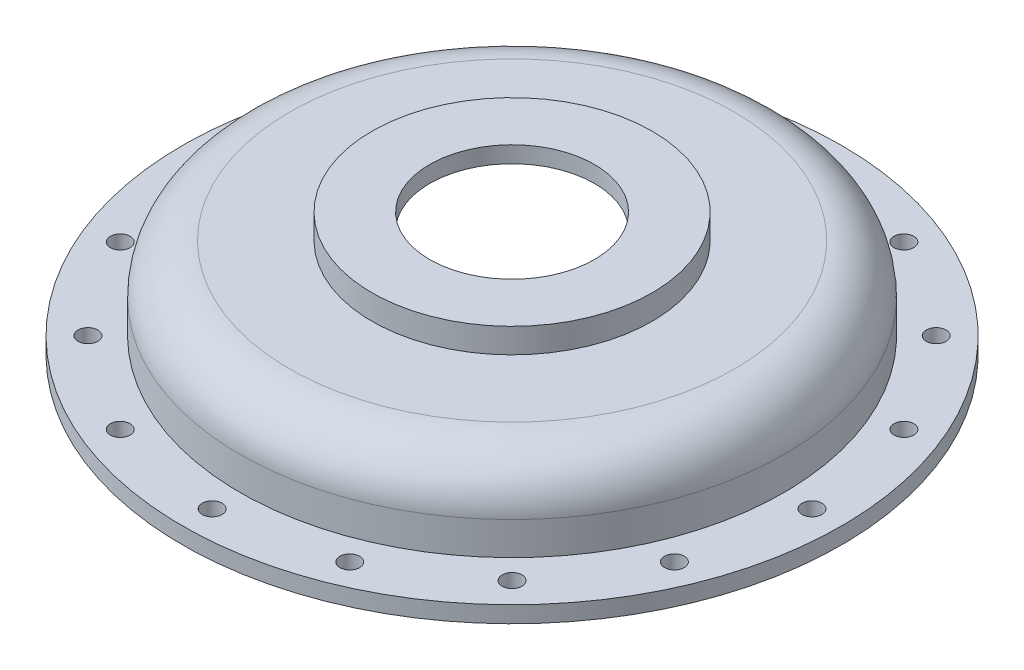
ISO-10303-21;
HEADER;
FILE_DESCRIPTION(('STEP AP214'),'2;1');
FILE_NAME('part.step','',(''),(''),'','','');
FILE_SCHEMA(('AUTOMOTIVE_DESIGN { 1 0 10303 214 1 1 1 1 }'));
ENDSEC;
DATA;
#1=APPLICATION_CONTEXT('core data for automotive mechanical design processes');
#2=APPLICATION_PROTOCOL_DEFINITION('international standard','automotive_design',2000,#1);
#3=PRODUCT_CONTEXT('',#1,'mechanical');
#4=PRODUCT('Part','Part','',(#3));
#5=PRODUCT_RELATED_PRODUCT_CATEGORY('part','',(#4));
#6=PRODUCT_DEFINITION_FORMATION('','',#4);
#7=PRODUCT_DEFINITION_CONTEXT('part definition',#1,'design');
#8=PRODUCT_DEFINITION('design','',#6,#7);
#9=PRODUCT_DEFINITION_SHAPE('','',#8);
#10=(LENGTH_UNIT() NAMED_UNIT(*) SI_UNIT(.MILLI.,.METRE.));
#11=(NAMED_UNIT(*) PLANE_ANGLE_UNIT() SI_UNIT($,.RADIAN.));
#12=(NAMED_UNIT(*) SI_UNIT($,.STERADIAN.) SOLID_ANGLE_UNIT());
#13=UNCERTAINTY_MEASURE_WITH_UNIT(LENGTH_MEASURE(1.E-05),#10,'distance_accuracy_value','');
#14=(GEOMETRIC_REPRESENTATION_CONTEXT(3) GLOBAL_UNCERTAINTY_ASSIGNED_CONTEXT((#13)) GLOBAL_UNIT_ASSIGNED_CONTEXT((#10,
#11,#12)) REPRESENTATION_CONTEXT('',''));
#15=CARTESIAN_POINT('',(0.,0.,0.));
#16=DIRECTION('',(0.,0.,1.));
#17=DIRECTION('',(1.,0.,0.));
#18=AXIS2_PLACEMENT_3D('',#15,#16,#17);
#19=CARTESIAN_POINT('',(200.,-46.5685424949238,0.));
#20=DIRECTION('',(0.,1.,0.));
#21=DIRECTION('',(0.,0.,1.));
#22=AXIS2_PLACEMENT_3D('',#19,#20,#21);
#23=PLANE('',#22);
#24=CARTESIAN_POINT('',(-128.693434175952,-46.5685424949238,-128.693434175951));
#25=DIRECTION('',(0.,1.,0.));
#26=DIRECTION('',(0.707106781186549,0.,0.707106781186546));
#27=AXIS2_PLACEMENT_3D('',#24,#25,#26);
#28=CIRCLE('',#27,6.);
#29=CARTESIAN_POINT('',(-124.450793488833,-46.5685424949238,-124.450793488832));
#30=VERTEX_POINT('',#29);
#31=EDGE_CURVE('E172',#30,#30,#28,.T.);
#32=ORIENTED_EDGE('',*,*,#31,.F.);
#33=EDGE_LOOP('',(#32));
#34=FACE_BOUND('',#33,.T.);
#35=CARTESIAN_POINT('',(-168.146074917054,-46.5685424949238,-69.6483846904459));
#36=DIRECTION('',(0.,1.,0.));
#37=DIRECTION('',(0.923879532511288,0.,0.382683432365087));
#38=AXIS2_PLACEMENT_3D('',#35,#36,#37);
#39=CIRCLE('',#38,6.);
#40=CARTESIAN_POINT('',(-162.602797721987,-46.5685424949238,-67.3522840962554));
#41=VERTEX_POINT('',#40);
#42=EDGE_CURVE('E164',#41,#41,#39,.T.);
#43=ORIENTED_EDGE('',*,*,#42,.F.);
#44=EDGE_LOOP('',(#43));
#45=FACE_BOUND('',#44,.T.);
#46=CARTESIAN_POINT('',(-182.,-46.5685424949238,6.3544960366945E-13));
#47=DIRECTION('',(0.,1.,0.));
#48=DIRECTION('',(1.,0.,0.));
#49=AXIS2_PLACEMENT_3D('',#46,#47,#48);
#50=CIRCLE('',#49,6.);
#51=CARTESIAN_POINT('',(-176.,-46.5685424949238,6.14500715636391E-13));
#52=VERTEX_POINT('',#51);
#53=EDGE_CURVE('E156',#52,#52,#50,.T.);
#54=ORIENTED_EDGE('',*,*,#53,.F.);
#55=EDGE_LOOP('',(#54));
#56=FACE_BOUND('',#55,.T.);
#57=CARTESIAN_POINT('',(-168.146074917054,-46.5685424949238,69.6483846904471));
#58=DIRECTION('',(0.,1.,0.));
#59=DIRECTION('',(0.923879532511285,0.,-0.382683432365094));
#60=AXIS2_PLACEMENT_3D('',#57,#58,#59);
#61=CIRCLE('',#60,6.);
#62=CARTESIAN_POINT('',(-162.602797721986,-46.5685424949238,67.3522840962565));
#63=VERTEX_POINT('',#62);
#64=EDGE_CURVE('E148',#63,#63,#61,.T.);
#65=ORIENTED_EDGE('',*,*,#64,.F.);
#66=EDGE_LOOP('',(#65));
#67=FACE_BOUND('',#66,.T.);
#68=CARTESIAN_POINT('',(-128.693434175951,-46.5685424949238,128.693434175952));
#69=DIRECTION('',(0.,1.,0.));
#70=DIRECTION('',(0.707106781186544,0.,-0.707106781186551));
#71=AXIS2_PLACEMENT_3D('',#68,#69,#70);
#72=CIRCLE('',#71,6.);
#73=CARTESIAN_POINT('',(-124.450793488832,-46.5685424949238,124.450793488833));
#74=VERTEX_POINT('',#73);
#75=EDGE_CURVE('E140',#74,#74,#72,.T.);
#76=ORIENTED_EDGE('',*,*,#75,.F.);
#77=EDGE_LOOP('',(#76));
#78=FACE_BOUND('',#77,.T.);
#79=CARTESIAN_POINT('',(-69.6483846904453,-46.5685424949238,168.146074917055));
#80=DIRECTION('',(0.,1.,0.));
#81=DIRECTION('',(0.382683432365084,0.,-0.923879532511289));
#82=AXIS2_PLACEMENT_3D('',#79,#80,#81);
#83=CIRCLE('',#82,6.);
#84=CARTESIAN_POINT('',(-67.3522840962548,-46.5685424949238,162.602797721987));
#85=VERTEX_POINT('',#84);
#86=EDGE_CURVE('E132',#85,#85,#83,.T.);
#87=ORIENTED_EDGE('',*,*,#86,.F.);
#88=EDGE_LOOP('',(#87));
#89=FACE_BOUND('',#88,.T.);
#90=CARTESIAN_POINT('',(0.,-46.5685424949238,182.));
#91=DIRECTION('',(0.,1.,0.));
#92=DIRECTION('',(0.,0.,-1.));
#93=AXIS2_PLACEMENT_3D('',#90,#91,#92);
#94=CIRCLE('',#93,6.);
#95=CARTESIAN_POINT('',(0.,-46.5685424949238,176.));
#96=VERTEX_POINT('',#95);
#97=EDGE_CURVE('E124',#96,#96,#94,.T.);
#98=ORIENTED_EDGE('',*,*,#97,.F.);
#99=EDGE_LOOP('',(#98));
#100=FACE_BOUND('',#99,.T.);
#101=CARTESIAN_POINT('',(69.6483846904477,-46.5685424949238,168.146074917054));
#102=DIRECTION('',(0.,1.,0.));
#103=DIRECTION('',(-0.382683432365097,0.,-0.923879532511284));
#104=AXIS2_PLACEMENT_3D('',#101,#102,#103);
#105=CIRCLE('',#104,6.);
#106=CARTESIAN_POINT('',(67.3522840962571,-46.5685424949238,162.602797721986));
#107=VERTEX_POINT('',#106);
#108=EDGE_CURVE('E115',#107,#107,#105,.T.);
#109=ORIENTED_EDGE('',*,*,#108,.F.);
#110=EDGE_LOOP('',(#109));
#111=FACE_BOUND('',#110,.T.);
#112=CARTESIAN_POINT('',(128.693434175953,-46.5685424949238,128.693434175951));
#113=DIRECTION('',(0.,1.,0.));
#114=DIRECTION('',(-0.707106781186554,0.,-0.707106781186541));
#115=AXIS2_PLACEMENT_3D('',#112,#113,#114);
#116=CIRCLE('',#115,6.);
#117=CARTESIAN_POINT('',(124.450793488833,-46.5685424949238,124.450793488831));
#118=VERTEX_POINT('',#117);
#119=EDGE_CURVE('E219',#118,#118,#116,.T.);
#120=ORIENTED_EDGE('',*,*,#119,.F.);
#121=EDGE_LOOP('',(#120));
#122=FACE_BOUND('',#121,.T.);
#123=CARTESIAN_POINT('',(168.146074917055,-46.5685424949238,69.6483846904447));
#124=DIRECTION('',(0.,1.,0.));
#125=DIRECTION('',(-0.923879532511291,0.,-0.382683432365081));
#126=AXIS2_PLACEMENT_3D('',#123,#124,#125);
#127=CIRCLE('',#126,6.);
#128=CARTESIAN_POINT('',(162.602797721987,-46.5685424949238,67.3522840962542));
#129=VERTEX_POINT('',#128);
#130=EDGE_CURVE('E211',#129,#129,#127,.T.);
#131=ORIENTED_EDGE('',*,*,#130,.F.);
#132=EDGE_LOOP('',(#131));
#133=FACE_BOUND('',#132,.T.);
#134=CARTESIAN_POINT('',(182.,-46.5685424949238,-1.90634881100835E-12));
#135=DIRECTION('',(0.,1.,0.));
#136=DIRECTION('',(-1.,0.,0.));
#137=AXIS2_PLACEMENT_3D('',#134,#135,#136);
#138=CIRCLE('',#137,6.);
#139=CARTESIAN_POINT('',(176.,-46.5685424949238,-1.84350214690917E-12));
#140=VERTEX_POINT('',#139);
#141=EDGE_CURVE('E203',#140,#140,#138,.T.);
#142=ORIENTED_EDGE('',*,*,#141,.F.);
#143=EDGE_LOOP('',(#142));
#144=FACE_BOUND('',#143,.T.);
#145=CARTESIAN_POINT('',(168.146074917053,-46.5685424949238,-69.6483846904482));
#146=DIRECTION('',(0.,1.,0.));
#147=DIRECTION('',(-0.923879532511283,0.,0.3826834323651));
#148=AXIS2_PLACEMENT_3D('',#145,#146,#147);
#149=CIRCLE('',#148,6.);
#150=CARTESIAN_POINT('',(162.602797721986,-46.5685424949238,-67.3522840962576));
#151=VERTEX_POINT('',#150);
#152=EDGE_CURVE('E195',#151,#151,#149,.T.);
#153=ORIENTED_EDGE('',*,*,#152,.F.);
#154=EDGE_LOOP('',(#153));
#155=FACE_BOUND('',#154,.T.);
#156=CARTESIAN_POINT('',(128.69343417595,-46.5685424949238,-128.693434175953));
#157=DIRECTION('',(0.,1.,0.));
#158=DIRECTION('',(-0.707106781186539,0.,0.707106781186556));
#159=AXIS2_PLACEMENT_3D('',#156,#157,#158);
#160=CIRCLE('',#159,6.);
#161=CARTESIAN_POINT('',(124.450793488831,-46.5685424949238,-124.450793488834));
#162=VERTEX_POINT('',#161);
#163=EDGE_CURVE('E187',#162,#162,#160,.T.);
#164=ORIENTED_EDGE('',*,*,#163,.F.);
#165=EDGE_LOOP('',(#164));
#166=FACE_BOUND('',#165,.T.);
#167=CARTESIAN_POINT('',(69.6483846904441,-46.5685424949238,-168.146074917055));
#168=DIRECTION('',(0.,1.,0.));
#169=DIRECTION('',(-0.382683432365077,0.,0.923879532511292));
#170=AXIS2_PLACEMENT_3D('',#167,#168,#169);
#171=CIRCLE('',#170,6.);
#172=CARTESIAN_POINT('',(67.3522840962536,-46.5685424949238,-162.602797721987));
#173=VERTEX_POINT('',#172);
#174=EDGE_CURVE('E179',#173,#173,#171,.T.);
#175=ORIENTED_EDGE('',*,*,#174,.F.);
#176=EDGE_LOOP('',(#175));
#177=FACE_BOUND('',#176,.T.);
#178=CARTESIAN_POINT('',(-69.6483846904465,-46.5685424949238,-168.146074917054));
#179=DIRECTION('',(0.,1.,0.));
#180=DIRECTION('',(0.382683432365091,0.,0.923879532511287));
#181=AXIS2_PLACEMENT_3D('',#178,#179,#180);
#182=CIRCLE('',#181,6.);
#183=CARTESIAN_POINT('',(-67.352284096256,-46.5685424949238,-162.602797721986));
#184=VERTEX_POINT('',#183);
#185=EDGE_CURVE('E107',#184,#184,#182,.T.);
#186=ORIENTED_EDGE('',*,*,#185,.F.);
#187=EDGE_LOOP('',(#186));
#188=FACE_BOUND('',#187,.T.);
#189=CARTESIAN_POINT('',(0.,-46.5685424949238,-182.));
#190=DIRECTION('',(0.,1.,0.));
#191=DIRECTION('',(0.,0.,1.));
#192=AXIS2_PLACEMENT_3D('',#189,#190,#191);
#193=CIRCLE('',#192,6.);
#194=CARTESIAN_POINT('',(0.,-46.5685424949238,-176.));
#195=VERTEX_POINT('',#194);
#196=EDGE_CURVE('E99',#195,#195,#193,.T.);
#197=ORIENTED_EDGE('',*,*,#196,.F.);
#198=EDGE_LOOP('',(#197));
#199=FACE_BOUND('',#198,.T.);
#200=CARTESIAN_POINT('',(0.,-46.5685424949238,0.));
#201=DIRECTION('',(0.,-1.,0.));
#202=DIRECTION('',(0.,0.,-1.));
#203=AXIS2_PLACEMENT_3D('',#200,#201,#202);
#204=CIRCLE('',#203,165.);
#205=CARTESIAN_POINT('',(0.,-46.5685424949238,-165.));
#206=VERTEX_POINT('',#205);
#207=EDGE_CURVE('E10',#206,#206,#204,.T.);
#208=ORIENTED_EDGE('',*,*,#207,.T.);
#209=EDGE_LOOP('',(#208));
#210=FACE_BOUND('',#209,.T.);
#211=CARTESIAN_POINT('',(0.,-46.5685424949238,0.));
#212=DIRECTION('',(0.,-1.,0.));
#213=DIRECTION('',(0.,0.,-1.));
#214=AXIS2_PLACEMENT_3D('',#211,#212,#213);
#215=CIRCLE('',#214,200.);
#216=CARTESIAN_POINT('',(0.,-46.5685424949238,-200.));
#217=VERTEX_POINT('',#216);
#218=EDGE_CURVE('E94',#217,#217,#215,.T.);
#219=ORIENTED_EDGE('',*,*,#218,.F.);
#220=EDGE_LOOP('',(#219));
#221=FACE_BOUND('',#220,.T.);
#222=ADVANCED_FACE('F43',(#34,#45,#56,#67,#78,#89,#100,#111,#122,#133,#144,#155,#166,#177,#188,
#199,#210,#221),#23,.T.);
#223=CARTESIAN_POINT('',(0.,0.,0.));
#224=DIRECTION('',(0.,-1.,0.));
#225=DIRECTION('',(0.,0.,-1.));
#226=AXIS2_PLACEMENT_3D('',#223,#224,#225);
#227=CYLINDRICAL_SURFACE('',#226,165.);
#228=CARTESIAN_POINT('',(0.,-26.5685424949238,0.));
#229=DIRECTION('',(0.,-1.,0.));
#230=DIRECTION('',(0.,0.,-1.));
#231=AXIS2_PLACEMENT_3D('',#228,#229,#230);
#232=CIRCLE('',#231,165.);
#233=CARTESIAN_POINT('',(0.,-26.5685424949238,-165.));
#234=VERTEX_POINT('',#233);
#235=EDGE_CURVE('E51',#234,#234,#232,.T.);
#236=ORIENTED_EDGE('',*,*,#235,.T.);
#237=EDGE_LOOP('',(#236));
#238=FACE_BOUND('',#237,.T.);
#239=ORIENTED_EDGE('',*,*,#207,.F.);
#240=EDGE_LOOP('',(#239));
#241=FACE_BOUND('',#240,.T.);
#242=ADVANCED_FACE('F257',(#238,#241),#227,.T.);
#243=CARTESIAN_POINT('',(0.,-26.5685424949238,0.));
#244=DIRECTION('',(0.,-1.,0.));
#245=DIRECTION('',(0.,0.,-1.));
#246=AXIS2_PLACEMENT_3D('',#243,#244,#245);
#247=TOROIDAL_SURFACE('',#246,135.,30.);
#248=CARTESIAN_POINT('',(0.,3.43145750507618,0.));
#249=DIRECTION('',(0.,-1.,0.));
#250=DIRECTION('',(0.,0.,-1.));
#251=AXIS2_PLACEMENT_3D('',#248,#249,#250);
#252=CIRCLE('',#251,135.);
#253=CARTESIAN_POINT('',(0.,3.43145750507618,-135.));
#254=VERTEX_POINT('',#253);
#255=EDGE_CURVE('E56',#254,#254,#252,.T.);
#256=ORIENTED_EDGE('',*,*,#255,.T.);
#257=EDGE_LOOP('',(#256));
#258=FACE_BOUND('',#257,.T.);
#259=ORIENTED_EDGE('',*,*,#235,.F.);
#260=EDGE_LOOP('',(#259));
#261=FACE_BOUND('',#260,.T.);
#262=ADVANCED_FACE('F264',(#258,#261),#247,.T.);
#263=CARTESIAN_POINT('',(135.,3.43145750507617,0.));
#264=DIRECTION('',(0.,1.,0.));
#265=DIRECTION('',(0.,0.,1.));
#266=AXIS2_PLACEMENT_3D('',#263,#264,#265);
#267=PLANE('',#266);
#268=CARTESIAN_POINT('',(0.,3.43145750507617,0.));
#269=DIRECTION('',(0.,-1.,0.));
#270=DIRECTION('',(0.,0.,-1.));
#271=AXIS2_PLACEMENT_3D('',#268,#269,#270);
#272=CIRCLE('',#271,85.);
#273=CARTESIAN_POINT('',(0.,3.43145750507617,-85.));
#274=VERTEX_POINT('',#273);
#275=EDGE_CURVE('E62',#274,#274,#272,.T.);
#276=ORIENTED_EDGE('',*,*,#275,.T.);
#277=EDGE_LOOP('',(#276));
#278=FACE_BOUND('',#277,.T.);
#279=ORIENTED_EDGE('',*,*,#255,.F.);
#280=EDGE_LOOP('',(#279));
#281=FACE_BOUND('',#280,.T.);
#282=ADVANCED_FACE('F545',(#278,#281),#267,.T.);
#283=CARTESIAN_POINT('',(0.,0.,0.));
#284=DIRECTION('',(0.,-1.,0.));
#285=DIRECTION('',(0.,0.,-1.));
#286=AXIS2_PLACEMENT_3D('',#283,#284,#285);
#287=CYLINDRICAL_SURFACE('',#286,85.);
#288=CARTESIAN_POINT('',(0.,18.4314575050762,0.));
#289=DIRECTION('',(0.,-1.,0.));
#290=DIRECTION('',(0.,0.,-1.));
#291=AXIS2_PLACEMENT_3D('',#288,#289,#290);
#292=CIRCLE('',#291,85.);
#293=CARTESIAN_POINT('',(0.,18.4314575050762,-85.));
#294=VERTEX_POINT('',#293);
#295=EDGE_CURVE('E66',#294,#294,#292,.T.);
#296=ORIENTED_EDGE('',*,*,#295,.T.);
#297=EDGE_LOOP('',(#296));
#298=FACE_BOUND('',#297,.T.);
#299=ORIENTED_EDGE('',*,*,#275,.F.);
#300=EDGE_LOOP('',(#299));
#301=FACE_BOUND('',#300,.T.);
#302=ADVANCED_FACE('F405',(#298,#301),#287,.T.);
#303=CARTESIAN_POINT('',(85.,18.4314575050762,0.));
#304=DIRECTION('',(0.,1.,0.));
#305=DIRECTION('',(0.,0.,1.));
#306=AXIS2_PLACEMENT_3D('',#303,#304,#305);
#307=PLANE('',#306);
#308=CARTESIAN_POINT('',(0.,18.4314575050762,0.));
#309=DIRECTION('',(0.,1.,0.));
#310=DIRECTION('',(0.,0.,1.));
#311=AXIS2_PLACEMENT_3D('',#308,#309,#310);
#312=CIRCLE('',#311,50.);
#313=CARTESIAN_POINT('',(0.,18.4314575050762,50.));
#314=VERTEX_POINT('',#313);
#315=EDGE_CURVE('E226',#314,#314,#312,.T.);
#316=ORIENTED_EDGE('',*,*,#315,.F.);
#317=EDGE_LOOP('',(#316));
#318=FACE_BOUND('',#317,.T.);
#319=ORIENTED_EDGE('',*,*,#295,.F.);
#320=EDGE_LOOP('',(#319));
#321=FACE_BOUND('',#320,.T.);
#322=ADVANCED_FACE('F241',(#318,#321),#307,.T.);
#323=CARTESIAN_POINT('',(0.,8.43145750507615,0.));
#324=DIRECTION('',(0.,-1.,0.));
#325=DIRECTION('',(0.,0.,-1.));
#326=AXIS2_PLACEMENT_3D('',#323,#324,#325);
#327=PLANE('',#326);
#328=CARTESIAN_POINT('',(0.,8.43145750507615,0.));
#329=DIRECTION('',(0.,-1.,0.));
#330=DIRECTION('',(0.,0.,-1.));
#331=AXIS2_PLACEMENT_3D('',#328,#329,#330);
#332=CIRCLE('',#331,50.);
#333=CARTESIAN_POINT('',(0.,8.43145750507615,-50.));
#334=VERTEX_POINT('',#333);
#335=EDGE_CURVE('E46',#334,#334,#332,.T.);
#336=ORIENTED_EDGE('',*,*,#335,.F.);
#337=EDGE_LOOP('',(#336));
#338=FACE_BOUND('',#337,.T.);
#339=CARTESIAN_POINT('',(0.,8.43145750507614,0.));
#340=DIRECTION('',(0.,-1.,0.));
#341=DIRECTION('',(0.,0.,-1.));
#342=AXIS2_PLACEMENT_3D('',#339,#340,#341);
#343=CIRCLE('',#342,75.);
#344=CARTESIAN_POINT('',(0.,8.43145750507614,-75.));
#345=VERTEX_POINT('',#344);
#346=EDGE_CURVE('E70',#345,#345,#343,.T.);
#347=ORIENTED_EDGE('',*,*,#346,.T.);
#348=EDGE_LOOP('',(#347));
#349=FACE_BOUND('',#348,.T.);
#350=ADVANCED_FACE('F237',(#338,#349),#327,.T.);
#351=CARTESIAN_POINT('',(0.,0.,0.));
#352=DIRECTION('',(0.,-1.,0.));
#353=DIRECTION('',(0.,0.,-1.));
#354=AXIS2_PLACEMENT_3D('',#351,#352,#353);
#355=CYLINDRICAL_SURFACE('',#354,75.);
#356=CARTESIAN_POINT('',(0.,-6.56854249492383,0.));
#357=DIRECTION('',(0.,-1.,0.));
#358=DIRECTION('',(0.,0.,-1.));
#359=AXIS2_PLACEMENT_3D('',#356,#357,#358);
#360=CIRCLE('',#359,75.);
#361=CARTESIAN_POINT('',(0.,-6.56854249492383,-75.));
#362=VERTEX_POINT('',#361);
#363=EDGE_CURVE('E74',#362,#362,#360,.T.);
#364=ORIENTED_EDGE('',*,*,#363,.T.);
#365=EDGE_LOOP('',(#364));
#366=FACE_BOUND('',#365,.T.);
#367=ORIENTED_EDGE('',*,*,#346,.F.);
#368=EDGE_LOOP('',(#367));
#369=FACE_BOUND('',#368,.T.);
#370=ADVANCED_FACE('F240',(#366,#369),#355,.F.);
#371=CARTESIAN_POINT('',(75.,-6.56854249492383,0.));
#372=DIRECTION('',(0.,-1.,0.));
#373=DIRECTION('',(0.,0.,-1.));
#374=AXIS2_PLACEMENT_3D('',#371,#372,#373);
#375=PLANE('',#374);
#376=CARTESIAN_POINT('',(0.,-6.56854249492383,0.));
#377=DIRECTION('',(0.,-1.,0.));
#378=DIRECTION('',(0.,0.,-1.));
#379=AXIS2_PLACEMENT_3D('',#376,#377,#378);
#380=CIRCLE('',#379,134.255065140802);
#381=CARTESIAN_POINT('',(0.,-6.56854249492383,-134.255065140802));
#382=VERTEX_POINT('',#381);
#383=EDGE_CURVE('E78',#382,#382,#380,.T.);
#384=ORIENTED_EDGE('',*,*,#383,.T.);
#385=EDGE_LOOP('',(#384));
#386=FACE_BOUND('',#385,.T.);
#387=ORIENTED_EDGE('',*,*,#363,.F.);
#388=EDGE_LOOP('',(#387));
#389=FACE_BOUND('',#388,.T.);
#390=ADVANCED_FACE('F246',(#386,#389),#375,.T.);
#391=CARTESIAN_POINT('',(0.,-27.3273505527333,0.));
#392=DIRECTION('',(0.,-1.,0.));
#393=DIRECTION('',(0.,0.,-1.));
#394=AXIS2_PLACEMENT_3D('',#391,#392,#393);
#395=TOROIDAL_SURFACE('',#394,134.255065140802,20.7588080578095);
#396=CARTESIAN_POINT('',(0.,-26.5685424949238,0.));
#397=DIRECTION('',(0.,-1.,0.));
#398=DIRECTION('',(0.,0.,-1.));
#399=AXIS2_PLACEMENT_3D('',#396,#397,#398);
#400=CIRCLE('',#399,155.);
#401=CARTESIAN_POINT('',(0.,-26.5685424949238,-155.));
#402=VERTEX_POINT('',#401);
#403=EDGE_CURVE('E82',#402,#402,#400,.T.);
#404=ORIENTED_EDGE('',*,*,#403,.T.);
#405=EDGE_LOOP('',(#404));
#406=FACE_BOUND('',#405,.T.);
#407=ORIENTED_EDGE('',*,*,#383,.F.);
#408=EDGE_LOOP('',(#407));
#409=FACE_BOUND('',#408,.T.);
#410=ADVANCED_FACE('F253',(#406,#409),#395,.F.);
#411=CARTESIAN_POINT('',(0.,0.,0.));
#412=DIRECTION('',(0.,-1.,0.));
#413=DIRECTION('',(0.,0.,-1.));
#414=AXIS2_PLACEMENT_3D('',#411,#412,#413);
#415=CYLINDRICAL_SURFACE('',#414,155.);
#416=CARTESIAN_POINT('',(0.,-56.5685424949238,0.));
#417=DIRECTION('',(0.,-1.,0.));
#418=DIRECTION('',(0.,0.,-1.));
#419=AXIS2_PLACEMENT_3D('',#416,#417,#418);
#420=CIRCLE('',#419,155.);
#421=CARTESIAN_POINT('',(0.,-56.5685424949238,-155.));
#422=VERTEX_POINT('',#421);
#423=EDGE_CURVE('E86',#422,#422,#420,.T.);
#424=ORIENTED_EDGE('',*,*,#423,.T.);
#425=EDGE_LOOP('',(#424));
#426=FACE_BOUND('',#425,.T.);
#427=ORIENTED_EDGE('',*,*,#403,.F.);
#428=EDGE_LOOP('',(#427));
#429=FACE_BOUND('',#428,.T.);
#430=ADVANCED_FACE('F309',(#426,#429),#415,.F.);
#431=CARTESIAN_POINT('',(155.,-56.5685424949238,0.));
#432=DIRECTION('',(0.,-1.,0.));
#433=DIRECTION('',(0.,0.,-1.));
#434=AXIS2_PLACEMENT_3D('',#431,#432,#433);
#435=PLANE('',#434);
#436=CARTESIAN_POINT('',(-128.693434175952,-56.5685424949238,-128.693434175951));
#437=DIRECTION('',(0.,1.,0.));
#438=DIRECTION('',(0.707106781186549,0.,0.707106781186546));
#439=AXIS2_PLACEMENT_3D('',#436,#437,#438);
#440=CIRCLE('',#439,6.);
#441=CARTESIAN_POINT('',(-124.450793488833,-56.5685424949238,-124.450793488832));
#442=VERTEX_POINT('',#441);
#443=EDGE_CURVE('E111',#442,#442,#440,.T.);
#444=ORIENTED_EDGE('',*,*,#443,.T.);
#445=EDGE_LOOP('',(#444));
#446=FACE_BOUND('',#445,.T.);
#447=CARTESIAN_POINT('',(-168.146074917054,-56.5685424949238,-69.6483846904459));
#448=DIRECTION('',(0.,1.,0.));
#449=DIRECTION('',(0.923879532511288,0.,0.382683432365087));
#450=AXIS2_PLACEMENT_3D('',#447,#448,#449);
#451=CIRCLE('',#450,6.);
#452=CARTESIAN_POINT('',(-162.602797721987,-56.5685424949238,-67.3522840962554));
#453=VERTEX_POINT('',#452);
#454=EDGE_CURVE('E168',#453,#453,#451,.T.);
#455=ORIENTED_EDGE('',*,*,#454,.T.);
#456=EDGE_LOOP('',(#455));
#457=FACE_BOUND('',#456,.T.);
#458=CARTESIAN_POINT('',(-182.,-56.5685424949238,6.3544960366945E-13));
#459=DIRECTION('',(0.,1.,0.));
#460=DIRECTION('',(1.,0.,0.));
#461=AXIS2_PLACEMENT_3D('',#458,#459,#460);
#462=CIRCLE('',#461,6.);
#463=CARTESIAN_POINT('',(-176.,-56.5685424949238,6.14500715636391E-13));
#464=VERTEX_POINT('',#463);
#465=EDGE_CURVE('E160',#464,#464,#462,.T.);
#466=ORIENTED_EDGE('',*,*,#465,.T.);
#467=EDGE_LOOP('',(#466));
#468=FACE_BOUND('',#467,.T.);
#469=CARTESIAN_POINT('',(-168.146074917054,-56.5685424949238,69.6483846904471));
#470=DIRECTION('',(0.,1.,0.));
#471=DIRECTION('',(0.923879532511285,0.,-0.382683432365094));
#472=AXIS2_PLACEMENT_3D('',#469,#470,#471);
#473=CIRCLE('',#472,6.);
#474=CARTESIAN_POINT('',(-162.602797721986,-56.5685424949238,67.3522840962565));
#475=VERTEX_POINT('',#474);
#476=EDGE_CURVE('E152',#475,#475,#473,.T.);
#477=ORIENTED_EDGE('',*,*,#476,.T.);
#478=EDGE_LOOP('',(#477));
#479=FACE_BOUND('',#478,.T.);
#480=CARTESIAN_POINT('',(-128.693434175951,-56.5685424949238,128.693434175952));
#481=DIRECTION('',(0.,1.,0.));
#482=DIRECTION('',(0.707106781186544,0.,-0.707106781186551));
#483=AXIS2_PLACEMENT_3D('',#480,#481,#482);
#484=CIRCLE('',#483,6.);
#485=CARTESIAN_POINT('',(-124.450793488832,-56.5685424949238,124.450793488833));
#486=VERTEX_POINT('',#485);
#487=EDGE_CURVE('E144',#486,#486,#484,.T.);
#488=ORIENTED_EDGE('',*,*,#487,.T.);
#489=EDGE_LOOP('',(#488));
#490=FACE_BOUND('',#489,.T.);
#491=CARTESIAN_POINT('',(-69.6483846904453,-56.5685424949238,168.146074917055));
#492=DIRECTION('',(0.,1.,0.));
#493=DIRECTION('',(0.382683432365084,0.,-0.923879532511289));
#494=AXIS2_PLACEMENT_3D('',#491,#492,#493);
#495=CIRCLE('',#494,6.);
#496=CARTESIAN_POINT('',(-67.3522840962548,-56.5685424949238,162.602797721987));
#497=VERTEX_POINT('',#496);
#498=EDGE_CURVE('E136',#497,#497,#495,.T.);
#499=ORIENTED_EDGE('',*,*,#498,.T.);
#500=EDGE_LOOP('',(#499));
#501=FACE_BOUND('',#500,.T.);
#502=CARTESIAN_POINT('',(0.,-56.5685424949238,182.));
#503=DIRECTION('',(0.,1.,0.));
#504=DIRECTION('',(0.,0.,-1.));
#505=AXIS2_PLACEMENT_3D('',#502,#503,#504);
#506=CIRCLE('',#505,6.);
#507=CARTESIAN_POINT('',(0.,-56.5685424949238,176.));
#508=VERTEX_POINT('',#507);
#509=EDGE_CURVE('E128',#508,#508,#506,.T.);
#510=ORIENTED_EDGE('',*,*,#509,.T.);
#511=EDGE_LOOP('',(#510));
#512=FACE_BOUND('',#511,.T.);
#513=CARTESIAN_POINT('',(69.6483846904477,-56.5685424949238,168.146074917054));
#514=DIRECTION('',(0.,1.,0.));
#515=DIRECTION('',(-0.382683432365097,0.,-0.923879532511284));
#516=AXIS2_PLACEMENT_3D('',#513,#514,#515);
#517=CIRCLE('',#516,6.);
#518=CARTESIAN_POINT('',(67.3522840962571,-56.5685424949238,162.602797721986));
#519=VERTEX_POINT('',#518);
#520=EDGE_CURVE('E119',#519,#519,#517,.T.);
#521=ORIENTED_EDGE('',*,*,#520,.T.);
#522=EDGE_LOOP('',(#521));
#523=FACE_BOUND('',#522,.T.);
#524=CARTESIAN_POINT('',(128.693434175953,-56.5685424949238,128.693434175951));
#525=DIRECTION('',(0.,1.,0.));
#526=DIRECTION('',(-0.707106781186554,0.,-0.707106781186541));
#527=AXIS2_PLACEMENT_3D('',#524,#525,#526);
#528=CIRCLE('',#527,6.);
#529=CARTESIAN_POINT('',(124.450793488833,-56.5685424949238,124.450793488831));
#530=VERTEX_POINT('',#529);
#531=EDGE_CURVE('E120',#530,#530,#528,.T.);
#532=ORIENTED_EDGE('',*,*,#531,.T.);
#533=EDGE_LOOP('',(#532));
#534=FACE_BOUND('',#533,.T.);
#535=CARTESIAN_POINT('',(168.146074917055,-56.5685424949238,69.6483846904447));
#536=DIRECTION('',(0.,1.,0.));
#537=DIRECTION('',(-0.923879532511291,0.,-0.382683432365081));
#538=AXIS2_PLACEMENT_3D('',#535,#536,#537);
#539=CIRCLE('',#538,6.);
#540=CARTESIAN_POINT('',(162.602797721987,-56.5685424949238,67.3522840962542));
#541=VERTEX_POINT('',#540);
#542=EDGE_CURVE('E215',#541,#541,#539,.T.);
#543=ORIENTED_EDGE('',*,*,#542,.T.);
#544=EDGE_LOOP('',(#543));
#545=FACE_BOUND('',#544,.T.);
#546=CARTESIAN_POINT('',(182.,-56.5685424949238,-1.90634881100835E-12));
#547=DIRECTION('',(0.,1.,0.));
#548=DIRECTION('',(-1.,0.,0.));
#549=AXIS2_PLACEMENT_3D('',#546,#547,#548);
#550=CIRCLE('',#549,6.);
#551=CARTESIAN_POINT('',(176.,-56.5685424949238,-1.84350214690917E-12));
#552=VERTEX_POINT('',#551);
#553=EDGE_CURVE('E207',#552,#552,#550,.T.);
#554=ORIENTED_EDGE('',*,*,#553,.T.);
#555=EDGE_LOOP('',(#554));
#556=FACE_BOUND('',#555,.T.);
#557=CARTESIAN_POINT('',(168.146074917053,-56.5685424949238,-69.6483846904482));
#558=DIRECTION('',(0.,1.,0.));
#559=DIRECTION('',(-0.923879532511283,0.,0.3826834323651));
#560=AXIS2_PLACEMENT_3D('',#557,#558,#559);
#561=CIRCLE('',#560,6.);
#562=CARTESIAN_POINT('',(162.602797721986,-56.5685424949238,-67.3522840962576));
#563=VERTEX_POINT('',#562);
#564=EDGE_CURVE('E199',#563,#563,#561,.T.);
#565=ORIENTED_EDGE('',*,*,#564,.T.);
#566=EDGE_LOOP('',(#565));
#567=FACE_BOUND('',#566,.T.);
#568=CARTESIAN_POINT('',(128.69343417595,-56.5685424949238,-128.693434175953));
#569=DIRECTION('',(0.,1.,0.));
#570=DIRECTION('',(-0.707106781186539,0.,0.707106781186556));
#571=AXIS2_PLACEMENT_3D('',#568,#569,#570);
#572=CIRCLE('',#571,6.);
#573=CARTESIAN_POINT('',(124.450793488831,-56.5685424949238,-124.450793488834));
#574=VERTEX_POINT('',#573);
#575=EDGE_CURVE('E191',#574,#574,#572,.T.);
#576=ORIENTED_EDGE('',*,*,#575,.T.);
#577=EDGE_LOOP('',(#576));
#578=FACE_BOUND('',#577,.T.);
#579=CARTESIAN_POINT('',(69.6483846904441,-56.5685424949238,-168.146074917055));
#580=DIRECTION('',(0.,1.,0.));
#581=DIRECTION('',(-0.382683432365077,0.,0.923879532511292));
#582=AXIS2_PLACEMENT_3D('',#579,#580,#581);
#583=CIRCLE('',#582,6.);
#584=CARTESIAN_POINT('',(67.3522840962536,-56.5685424949238,-162.602797721987));
#585=VERTEX_POINT('',#584);
#586=EDGE_CURVE('E183',#585,#585,#583,.T.);
#587=ORIENTED_EDGE('',*,*,#586,.T.);
#588=EDGE_LOOP('',(#587));
#589=FACE_BOUND('',#588,.T.);
#590=CARTESIAN_POINT('',(-69.6483846904465,-56.5685424949238,-168.146074917054));
#591=DIRECTION('',(0.,1.,0.));
#592=DIRECTION('',(0.382683432365091,0.,0.923879532511287));
#593=AXIS2_PLACEMENT_3D('',#590,#591,#592);
#594=CIRCLE('',#593,6.);
#595=CARTESIAN_POINT('',(-67.352284096256,-56.5685424949238,-162.602797721986));
#596=VERTEX_POINT('',#595);
#597=EDGE_CURVE('E103',#596,#596,#594,.T.);
#598=ORIENTED_EDGE('',*,*,#597,.T.);
#599=EDGE_LOOP('',(#598));
#600=FACE_BOUND('',#599,.T.);
#601=CARTESIAN_POINT('',(0.,-56.5685424949238,-182.));
#602=DIRECTION('',(0.,1.,0.));
#603=DIRECTION('',(0.,0.,1.));
#604=AXIS2_PLACEMENT_3D('',#601,#602,#603);
#605=CIRCLE('',#604,6.);
#606=CARTESIAN_POINT('',(0.,-56.5685424949238,-176.));
#607=VERTEX_POINT('',#606);
#608=EDGE_CURVE('E98',#607,#607,#605,.T.);
#609=ORIENTED_EDGE('',*,*,#608,.T.);
#610=EDGE_LOOP('',(#609));
#611=FACE_BOUND('',#610,.T.);
#612=CARTESIAN_POINT('',(0.,-56.5685424949238,0.));
#613=DIRECTION('',(0.,-1.,0.));
#614=DIRECTION('',(0.,0.,-1.));
#615=AXIS2_PLACEMENT_3D('',#612,#613,#614);
#616=CIRCLE('',#615,200.);
#617=CARTESIAN_POINT('',(0.,-56.5685424949238,-200.));
#618=VERTEX_POINT('',#617);
#619=EDGE_CURVE('E90',#618,#618,#616,.T.);
#620=ORIENTED_EDGE('',*,*,#619,.T.);
#621=EDGE_LOOP('',(#620));
#622=FACE_BOUND('',#621,.T.);
#623=ORIENTED_EDGE('',*,*,#423,.F.);
#624=EDGE_LOOP('',(#623));
#625=FACE_BOUND('',#624,.T.);
#626=ADVANCED_FACE('F304',(#446,#457,#468,#479,#490,#501,#512,#523,#534,#545,#556,#567,#578,
#589,#600,#611,#622,#625),#435,.T.);
#627=CARTESIAN_POINT('',(0.,0.,0.));
#628=DIRECTION('',(0.,-1.,0.));
#629=DIRECTION('',(0.,0.,-1.));
#630=AXIS2_PLACEMENT_3D('',#627,#628,#629);
#631=CYLINDRICAL_SURFACE('',#630,200.);
#632=ORIENTED_EDGE('',*,*,#218,.T.);
#633=EDGE_LOOP('',(#632));
#634=FACE_BOUND('',#633,.T.);
#635=ORIENTED_EDGE('',*,*,#619,.F.);
#636=EDGE_LOOP('',(#635));
#637=FACE_BOUND('',#636,.T.);
#638=ADVANCED_FACE('F300',(#634,#637),#631,.T.);
#639=CARTESIAN_POINT('',(0.,-56.5685424949238,-182.));
#640=DIRECTION('',(0.,1.,0.));
#641=DIRECTION('',(0.,0.,1.));
#642=AXIS2_PLACEMENT_3D('',#639,#640,#641);
#643=CYLINDRICAL_SURFACE('',#642,6.);
#644=ORIENTED_EDGE('',*,*,#608,.F.);
#645=EDGE_LOOP('',(#644));
#646=FACE_BOUND('',#645,.T.);
#647=ORIENTED_EDGE('',*,*,#196,.T.);
#648=EDGE_LOOP('',(#647));
#649=FACE_BOUND('',#648,.T.);
#650=ADVANCED_FACE('F303',(#646,#649),#643,.F.);
#651=CARTESIAN_POINT('',(-69.6483846904465,-56.5685424949238,-168.146074917054));
#652=DIRECTION('',(0.,1.,0.));
#653=DIRECTION('',(0.,0.,1.));
#654=AXIS2_PLACEMENT_3D('',#651,#652,#653);
#655=CYLINDRICAL_SURFACE('',#654,6.);
#656=ORIENTED_EDGE('',*,*,#597,.F.);
#657=EDGE_LOOP('',(#656));
#658=FACE_BOUND('',#657,.T.);
#659=ORIENTED_EDGE('',*,*,#185,.T.);
#660=EDGE_LOOP('',(#659));
#661=FACE_BOUND('',#660,.T.);
#662=ADVANCED_FACE('F329',(#658,#661),#655,.F.);
#663=CARTESIAN_POINT('',(69.6483846904441,-56.5685424949238,-168.146074917055));
#664=DIRECTION('',(0.,1.,0.));
#665=DIRECTION('',(0.,0.,1.));
#666=AXIS2_PLACEMENT_3D('',#663,#664,#665);
#667=CYLINDRICAL_SURFACE('',#666,6.);
#668=ORIENTED_EDGE('',*,*,#586,.F.);
#669=EDGE_LOOP('',(#668));
#670=FACE_BOUND('',#669,.T.);
#671=ORIENTED_EDGE('',*,*,#174,.T.);
#672=EDGE_LOOP('',(#671));
#673=FACE_BOUND('',#672,.T.);
#674=ADVANCED_FACE('F333',(#670,#673),#667,.F.);
#675=CARTESIAN_POINT('',(128.69343417595,-56.5685424949238,-128.693434175953));
#676=DIRECTION('',(0.,1.,0.));
#677=DIRECTION('',(0.,0.,1.));
#678=AXIS2_PLACEMENT_3D('',#675,#676,#677);
#679=CYLINDRICAL_SURFACE('',#678,6.);
#680=ORIENTED_EDGE('',*,*,#575,.F.);
#681=EDGE_LOOP('',(#680));
#682=FACE_BOUND('',#681,.T.);
#683=ORIENTED_EDGE('',*,*,#163,.T.);
#684=EDGE_LOOP('',(#683));
#685=FACE_BOUND('',#684,.T.);
#686=ADVANCED_FACE('F370',(#682,#685),#679,.F.);
#687=CARTESIAN_POINT('',(168.146074917053,-56.5685424949238,-69.6483846904482));
#688=DIRECTION('',(0.,1.,0.));
#689=DIRECTION('',(0.,0.,1.));
#690=AXIS2_PLACEMENT_3D('',#687,#688,#689);
#691=CYLINDRICAL_SURFACE('',#690,6.);
#692=ORIENTED_EDGE('',*,*,#564,.F.);
#693=EDGE_LOOP('',(#692));
#694=FACE_BOUND('',#693,.T.);
#695=ORIENTED_EDGE('',*,*,#152,.T.);
#696=EDGE_LOOP('',(#695));
#697=FACE_BOUND('',#696,.T.);
#698=ADVANCED_FACE('F374',(#694,#697),#691,.F.);
#699=CARTESIAN_POINT('',(182.,-56.5685424949238,-1.90634881100835E-12));
#700=DIRECTION('',(0.,1.,0.));
#701=DIRECTION('',(0.,0.,1.));
#702=AXIS2_PLACEMENT_3D('',#699,#700,#701);
#703=CYLINDRICAL_SURFACE('',#702,6.);
#704=ORIENTED_EDGE('',*,*,#553,.F.);
#705=EDGE_LOOP('',(#704));
#706=FACE_BOUND('',#705,.T.);
#707=ORIENTED_EDGE('',*,*,#141,.T.);
#708=EDGE_LOOP('',(#707));
#709=FACE_BOUND('',#708,.T.);
#710=ADVANCED_FACE('F378',(#706,#709),#703,.F.);
#711=CARTESIAN_POINT('',(168.146074917055,-56.5685424949238,69.6483846904447));
#712=DIRECTION('',(0.,1.,0.));
#713=DIRECTION('',(0.,0.,1.));
#714=AXIS2_PLACEMENT_3D('',#711,#712,#713);
#715=CYLINDRICAL_SURFACE('',#714,6.);
#716=ORIENTED_EDGE('',*,*,#542,.F.);
#717=EDGE_LOOP('',(#716));
#718=FACE_BOUND('',#717,.T.);
#719=ORIENTED_EDGE('',*,*,#130,.T.);
#720=EDGE_LOOP('',(#719));
#721=FACE_BOUND('',#720,.T.);
#722=ADVANCED_FACE('F382',(#718,#721),#715,.F.);
#723=CARTESIAN_POINT('',(128.693434175953,-56.5685424949238,128.693434175951));
#724=DIRECTION('',(0.,1.,0.));
#725=DIRECTION('',(0.,0.,1.));
#726=AXIS2_PLACEMENT_3D('',#723,#724,#725);
#727=CYLINDRICAL_SURFACE('',#726,6.);
#728=ORIENTED_EDGE('',*,*,#531,.F.);
#729=EDGE_LOOP('',(#728));
#730=FACE_BOUND('',#729,.T.);
#731=ORIENTED_EDGE('',*,*,#119,.T.);
#732=EDGE_LOOP('',(#731));
#733=FACE_BOUND('',#732,.T.);
#734=ADVANCED_FACE('F339',(#730,#733),#727,.F.);
#735=CARTESIAN_POINT('',(69.6483846904477,-56.5685424949238,168.146074917054));
#736=DIRECTION('',(0.,1.,0.));
#737=DIRECTION('',(0.,0.,1.));
#738=AXIS2_PLACEMENT_3D('',#735,#736,#737);
#739=CYLINDRICAL_SURFACE('',#738,6.);
#740=ORIENTED_EDGE('',*,*,#520,.F.);
#741=EDGE_LOOP('',(#740));
#742=FACE_BOUND('',#741,.T.);
#743=ORIENTED_EDGE('',*,*,#108,.T.);
#744=EDGE_LOOP('',(#743));
#745=FACE_BOUND('',#744,.T.);
#746=ADVANCED_FACE('F335',(#742,#745),#739,.F.);
#747=CARTESIAN_POINT('',(0.,-56.5685424949238,182.));
#748=DIRECTION('',(0.,1.,0.));
#749=DIRECTION('',(0.,0.,1.));
#750=AXIS2_PLACEMENT_3D('',#747,#748,#749);
#751=CYLINDRICAL_SURFACE('',#750,6.);
#752=ORIENTED_EDGE('',*,*,#509,.F.);
#753=EDGE_LOOP('',(#752));
#754=FACE_BOUND('',#753,.T.);
#755=ORIENTED_EDGE('',*,*,#97,.T.);
#756=EDGE_LOOP('',(#755));
#757=FACE_BOUND('',#756,.T.);
#758=ADVANCED_FACE('F338',(#754,#757),#751,.F.);
#759=CARTESIAN_POINT('',(-69.6483846904453,-56.5685424949238,168.146074917055));
#760=DIRECTION('',(0.,1.,0.));
#761=DIRECTION('',(0.,0.,1.));
#762=AXIS2_PLACEMENT_3D('',#759,#760,#761);
#763=CYLINDRICAL_SURFACE('',#762,6.);
#764=ORIENTED_EDGE('',*,*,#498,.F.);
#765=EDGE_LOOP('',(#764));
#766=FACE_BOUND('',#765,.T.);
#767=ORIENTED_EDGE('',*,*,#86,.T.);
#768=EDGE_LOOP('',(#767));
#769=FACE_BOUND('',#768,.T.);
#770=ADVANCED_FACE('F343',(#766,#769),#763,.F.);
#771=CARTESIAN_POINT('',(-128.693434175951,-56.5685424949238,128.693434175952));
#772=DIRECTION('',(0.,1.,0.));
#773=DIRECTION('',(0.,0.,1.));
#774=AXIS2_PLACEMENT_3D('',#771,#772,#773);
#775=CYLINDRICAL_SURFACE('',#774,6.);
#776=ORIENTED_EDGE('',*,*,#487,.F.);
#777=EDGE_LOOP('',(#776));
#778=FACE_BOUND('',#777,.T.);
#779=ORIENTED_EDGE('',*,*,#75,.T.);
#780=EDGE_LOOP('',(#779));
#781=FACE_BOUND('',#780,.T.);
#782=ADVANCED_FACE('F347',(#778,#781),#775,.F.);
#783=CARTESIAN_POINT('',(-168.146074917054,-56.5685424949238,69.6483846904471));
#784=DIRECTION('',(0.,1.,0.));
#785=DIRECTION('',(0.,0.,1.));
#786=AXIS2_PLACEMENT_3D('',#783,#784,#785);
#787=CYLINDRICAL_SURFACE('',#786,6.);
#788=ORIENTED_EDGE('',*,*,#476,.F.);
#789=EDGE_LOOP('',(#788));
#790=FACE_BOUND('',#789,.T.);
#791=ORIENTED_EDGE('',*,*,#64,.T.);
#792=EDGE_LOOP('',(#791));
#793=FACE_BOUND('',#792,.T.);
#794=ADVANCED_FACE('F351',(#790,#793),#787,.F.);
#795=CARTESIAN_POINT('',(-182.,-56.5685424949238,6.3544960366945E-13));
#796=DIRECTION('',(0.,1.,0.));
#797=DIRECTION('',(0.,0.,1.));
#798=AXIS2_PLACEMENT_3D('',#795,#796,#797);
#799=CYLINDRICAL_SURFACE('',#798,6.);
#800=ORIENTED_EDGE('',*,*,#465,.F.);
#801=EDGE_LOOP('',(#800));
#802=FACE_BOUND('',#801,.T.);
#803=ORIENTED_EDGE('',*,*,#53,.T.);
#804=EDGE_LOOP('',(#803));
#805=FACE_BOUND('',#804,.T.);
#806=ADVANCED_FACE('F355',(#802,#805),#799,.F.);
#807=CARTESIAN_POINT('',(-168.146074917054,-56.5685424949238,-69.6483846904459));
#808=DIRECTION('',(0.,1.,0.));
#809=DIRECTION('',(0.,0.,1.));
#810=AXIS2_PLACEMENT_3D('',#807,#808,#809);
#811=CYLINDRICAL_SURFACE('',#810,6.);
#812=ORIENTED_EDGE('',*,*,#454,.F.);
#813=EDGE_LOOP('',(#812));
#814=FACE_BOUND('',#813,.T.);
#815=ORIENTED_EDGE('',*,*,#42,.T.);
#816=EDGE_LOOP('',(#815));
#817=FACE_BOUND('',#816,.T.);
#818=ADVANCED_FACE('F359',(#814,#817),#811,.F.);
#819=CARTESIAN_POINT('',(-128.693434175952,-56.5685424949238,-128.693434175951));
#820=DIRECTION('',(0.,1.,0.));
#821=DIRECTION('',(0.,0.,1.));
#822=AXIS2_PLACEMENT_3D('',#819,#820,#821);
#823=CYLINDRICAL_SURFACE('',#822,6.);
#824=ORIENTED_EDGE('',*,*,#443,.F.);
#825=EDGE_LOOP('',(#824));
#826=FACE_BOUND('',#825,.T.);
#827=ORIENTED_EDGE('',*,*,#31,.T.);
#828=EDGE_LOOP('',(#827));
#829=FACE_BOUND('',#828,.T.);
#830=ADVANCED_FACE('F363',(#826,#829),#823,.F.);
#831=CARTESIAN_POINT('',(0.,-56.5685424949238,0.));
#832=DIRECTION('',(0.,1.,0.));
#833=DIRECTION('',(0.,0.,1.));
#834=AXIS2_PLACEMENT_3D('',#831,#832,#833);
#835=CYLINDRICAL_SURFACE('',#834,50.);
#836=ORIENTED_EDGE('',*,*,#335,.T.);
#837=EDGE_LOOP('',(#836));
#838=FACE_BOUND('',#837,.T.);
#839=ORIENTED_EDGE('',*,*,#315,.T.);
#840=EDGE_LOOP('',(#839));
#841=FACE_BOUND('',#840,.T.);
#842=ADVANCED_FACE('F235',(#838,#841),#835,.F.);
#843=CLOSED_SHELL('',(#222,#242,#262,#282,#302,#322,#350,#370,#390,#410,#430,#626,#638,#650,
#662,#674,#686,#698,#710,#722,#734,#746,#758,#770,#782,#794,#806,#818,#830,#842));
#844=MANIFOLD_SOLID_BREP('B2',#843);
#845=ADVANCED_BREP_SHAPE_REPRESENTATION('',(#18,#844),#14);
#846=SHAPE_DEFINITION_REPRESENTATION(#9,#845);
ENDSEC;
END-ISO-10303-21;
